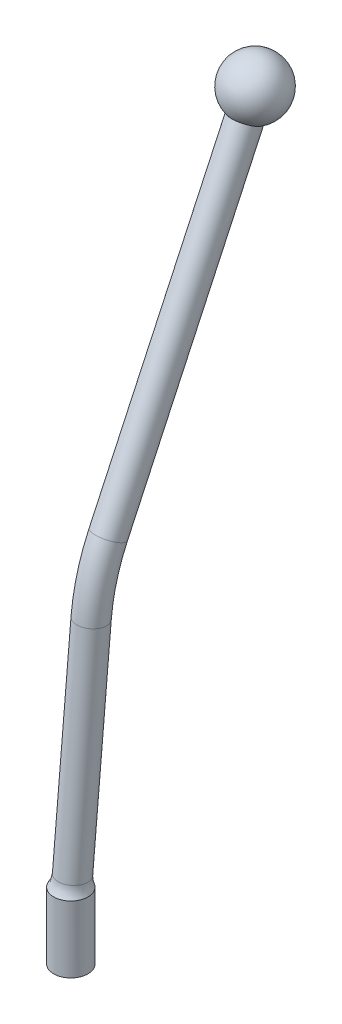
ISO-10303-21;
HEADER;
FILE_DESCRIPTION(('STEP AP214'),'2;1');
FILE_NAME('part.step','',(''),(''),'','','');
FILE_SCHEMA(('AUTOMOTIVE_DESIGN { 1 0 10303 214 1 1 1 1 }'));
ENDSEC;
DATA;
#1=APPLICATION_CONTEXT('core data for automotive mechanical design processes');
#2=APPLICATION_PROTOCOL_DEFINITION('international standard','automotive_design',2000,#1);
#3=PRODUCT_CONTEXT('',#1,'mechanical');
#4=PRODUCT('Part','Part','',(#3));
#5=PRODUCT_RELATED_PRODUCT_CATEGORY('part','',(#4));
#6=PRODUCT_DEFINITION_FORMATION('','',#4);
#7=PRODUCT_DEFINITION_CONTEXT('part definition',#1,'design');
#8=PRODUCT_DEFINITION('design','',#6,#7);
#9=PRODUCT_DEFINITION_SHAPE('','',#8);
#10=(LENGTH_UNIT() NAMED_UNIT(*) SI_UNIT(.MILLI.,.METRE.));
#11=(NAMED_UNIT(*) PLANE_ANGLE_UNIT() SI_UNIT($,.RADIAN.));
#12=(NAMED_UNIT(*) SI_UNIT($,.STERADIAN.) SOLID_ANGLE_UNIT());
#13=UNCERTAINTY_MEASURE_WITH_UNIT(LENGTH_MEASURE(1.E-05),#10,'distance_accuracy_value','');
#14=(GEOMETRIC_REPRESENTATION_CONTEXT(3) GLOBAL_UNCERTAINTY_ASSIGNED_CONTEXT((#13)) GLOBAL_UNIT_ASSIGNED_CONTEXT((#10,
#11,#12)) REPRESENTATION_CONTEXT('',''));
#15=CARTESIAN_POINT('',(0.,0.,0.));
#16=DIRECTION('',(0.,0.,1.));
#17=DIRECTION('',(1.,0.,0.));
#18=AXIS2_PLACEMENT_3D('',#15,#16,#17);
#19=CARTESIAN_POINT('',(0.,35.0728815140175,-9.6725456332811));
#20=DIRECTION('',(0.,-0.906307787036651,0.422618261740697));
#21=DIRECTION('',(0.,-0.422618261740697,-0.906307787036651));
#22=AXIS2_PLACEMENT_3D('',#19,#20,#21);
#23=CYLINDRICAL_SURFACE('',#22,0.75);
#24=CARTESIAN_POINT('',(0.,18.5447909300919,-1.96537041931714));
#25=DIRECTION('',(0.,0.906307787036651,-0.422618261740697));
#26=DIRECTION('',(0.,0.422618261740697,0.906307787036651));
#27=AXIS2_PLACEMENT_3D('',#24,#25,#26);
#28=CIRCLE('',#27,0.75);
#29=CARTESIAN_POINT('',(0.,18.8617546263974,-1.28563957903965));
#30=VERTEX_POINT('',#29);
#31=EDGE_CURVE('E133',#30,#30,#28,.T.);
#32=ORIENTED_EDGE('',*,*,#31,.T.);
#33=EDGE_LOOP('',(#32));
#34=FACE_BOUND('',#33,.T.);
#35=CARTESIAN_POINT('',(0.,33.8955531631854,-9.12354840712511));
#36=DIRECTION('',(0.,0.906307787036653,-0.422618261740697));
#37=DIRECTION('',(0.,0.422618261740696,0.906307787036651));
#38=AXIS2_PLACEMENT_3D('',#35,#36,#37);
#39=CIRCLE('',#38,0.75);
#40=CARTESIAN_POINT('',(0.,34.2125168594909,-8.44381756684762));
#41=VERTEX_POINT('',#40);
#42=EDGE_CURVE('E64',#41,#41,#39,.T.);
#43=ORIENTED_EDGE('',*,*,#42,.F.);
#44=EDGE_LOOP('',(#43));
#45=FACE_BOUND('',#44,.T.);
#46=ADVANCED_FACE('F52',(#34,#45),#23,.T.);
#47=CARTESIAN_POINT('',(0.,3.5,0.));
#48=DIRECTION('',(0.,-1.,0.));
#49=DIRECTION('',(0.,0.,-1.));
#50=AXIS2_PLACEMENT_3D('',#47,#48,#49);
#51=CYLINDRICAL_SURFACE('',#50,0.9);
#52=CARTESIAN_POINT('',(0.,3.5,0.));
#53=DIRECTION('',(0.,1.,0.));
#54=DIRECTION('',(0.,0.,1.));
#55=AXIS2_PLACEMENT_3D('',#52,#53,#54);
#56=CIRCLE('',#55,0.9);
#57=CARTESIAN_POINT('',(0.,3.5,0.9));
#58=VERTEX_POINT('',#57);
#59=EDGE_CURVE('E69',#58,#58,#56,.T.);
#60=ORIENTED_EDGE('',*,*,#59,.F.);
#61=EDGE_LOOP('',(#60));
#62=FACE_BOUND('',#61,.T.);
#63=CARTESIAN_POINT('',(0.,0.,0.));
#64=DIRECTION('',(0.,1.,0.));
#65=DIRECTION('',(0.,0.,1.));
#66=AXIS2_PLACEMENT_3D('',#63,#64,#65);
#67=CIRCLE('',#66,0.9);
#68=CARTESIAN_POINT('',(0.,0.,0.9));
#69=VERTEX_POINT('',#68);
#70=EDGE_CURVE('E140',#69,#69,#67,.T.);
#71=ORIENTED_EDGE('',*,*,#70,.T.);
#72=EDGE_LOOP('',(#71));
#73=FACE_BOUND('',#72,.T.);
#74=ADVANCED_FACE('F85',(#62,#73),#51,.T.);
#75=CARTESIAN_POINT('',(0.,0.,0.));
#76=DIRECTION('',(0.,1.,0.));
#77=DIRECTION('',(0.,0.,1.));
#78=AXIS2_PLACEMENT_3D('',#75,#76,#77);
#79=PLANE('',#78);
#80=ORIENTED_EDGE('',*,*,#70,.F.);
#81=EDGE_LOOP('',(#80));
#82=FACE_BOUND('',#81,.T.);
#83=ADVANCED_FACE('F99',(#82),#79,.F.);
#84=CARTESIAN_POINT('',(0.,14.3186083126849,-11.0284482896836));
#85=DIRECTION('',(1.,0.,0.));
#86=DIRECTION('',(0.,0.,-1.));
#87=AXIS2_PLACEMENT_3D('',#84,#85,#86);
#88=TOROIDAL_SURFACE('',#87,10.,0.75);
#89=CARTESIAN_POINT('',(0.,15.1901657401615,-1.06650130876619));
#90=DIRECTION('',(0.,0.996194698091746,-0.0871557427476545));
#91=DIRECTION('',(0.,0.0871557427476545,0.996194698091746));
#92=AXIS2_PLACEMENT_3D('',#89,#90,#91);
#93=CIRCLE('',#92,0.75);
#94=CARTESIAN_POINT('',(0.,15.2555325472222,-0.319355285197378));
#95=VERTEX_POINT('',#94);
#96=EDGE_CURVE('E135',#95,#95,#93,.T.);
#97=CARTESIAN_POINT('',(0.,14.3186083126849,-11.0284482896836));
#98=DIRECTION('',(1.,0.,0.));
#99=DIRECTION('',(0.,0.,-1.));
#100=AXIS2_PLACEMENT_3D('',#97,#98,#99);
#101=CIRCLE('',#100,10.75);
#102=EDGE_CURVE('',#30,#95,#101,.T.);
#103=ORIENTED_EDGE('',*,*,#31,.F.);
#104=ORIENTED_EDGE('',*,*,#96,.T.);
#105=ORIENTED_EDGE('',*,*,#102,.T.);
#106=ORIENTED_EDGE('',*,*,#102,.F.);
#107=EDGE_LOOP('',(#103,#105,#104,#106));
#108=FACE_BOUND('',#107,.T.);
#109=ADVANCED_FACE('F101',(#108),#88,.T.);
#110=CARTESIAN_POINT('',(0.,15.1901657401615,-1.06650130876619));
#111=DIRECTION('',(0.,-0.996194698091746,0.0871557427476545));
#112=DIRECTION('',(0.,-0.0871557427476545,-0.996194698091746));
#113=AXIS2_PLACEMENT_3D('',#110,#111,#112);
#114=CYLINDRICAL_SURFACE('',#113,0.75);
#115=CARTESIAN_POINT('',(0.144872665695192,3.5,0.888263424179094));
#116=CARTESIAN_POINT('',(0.115218978269698,3.74497205502854,0.678751725925156));
#117=CARTESIAN_POINT('',(0.11430068469154,4.06745761710978,0.650680038869779));
#118=CARTESIAN_POINT('',(0.0921290824477016,3.5,0.896865659666512));
#119=CARTESIAN_POINT('',(0.073220313796733,3.74494257312776,0.685308371742875));
#120=CARTESIAN_POINT('',(0.0726260908254238,4.06773638086897,0.65710651207005));
#121=CARTESIAN_POINT('',(0.0385680212555081,3.5,0.900762478531345));
#122=CARTESIAN_POINT('',(0.0306578230844865,3.74492808348338,0.688272401762609));
#123=CARTESIAN_POINT('',(0.030408063894255,4.067860466844,0.660010106207986));
#124=CARTESIAN_POINT('',(-0.0683853884735945,3.5,0.898990539138627));
#125=CARTESIAN_POINT('',(-0.0543580848616057,3.74493445468907,0.686923323638316));
#126=CARTESIAN_POINT('',(-0.0539162003488355,4.06780362065551,0.658688327513635));
#127=CARTESIAN_POINT('',(-0.121777737115939,3.5,0.893321786860164));
#128=CARTESIAN_POINT('',(-0.0968027482855262,3.74495531418536,0.682610498040408));
#129=CARTESIAN_POINT('',(-0.0960224377306163,4.06762268868264,0.654462959137402));
#130=CARTESIAN_POINT('',(-0.226594238547997,3.5,0.872644511394423));
#131=CARTESIAN_POINT('',(-0.180321745645892,3.74502457960037,0.666844380350451));
#132=CARTESIAN_POINT('',(-0.178924007320643,4.06694955779518,0.6390050445295));
#133=CARTESIAN_POINT('',(-0.278018564194649,3.5,0.857636810480751));
#134=CARTESIAN_POINT('',(-0.221388012795168,3.7450729698878,0.655394917555623));
#135=CARTESIAN_POINT('',(-0.219719454608506,4.06645738628446,0.627773115209686));
#136=CARTESIAN_POINT('',(-0.377210202240537,3.5,0.818870053100799));
#137=CARTESIAN_POINT('',(-0.300949170618562,3.74517715516498,0.625718638318771));
#138=CARTESIAN_POINT('',(-0.298845560735343,4.06514618564763,0.598624309389588));
#139=CARTESIAN_POINT('',(-0.424977512927383,3.5,0.795110992536743));
#140=CARTESIAN_POINT('',(-0.339437334214409,3.74523293678978,0.607497603116569));
#141=CARTESIAN_POINT('',(-0.337176218420183,4.06432715636847,0.580707429759115));
#142=CARTESIAN_POINT('',(-0.515347157362014,3.5,0.739747148962994));
#143=CARTESIAN_POINT('',(-0.412736386168035,3.74532170320238,0.564845272666399));
#144=CARTESIAN_POINT('',(-0.410288592219785,4.06234054080428,0.538699451876321));
#145=CARTESIAN_POINT('',(-0.557949016038035,3.5,0.70814164512152));
#146=CARTESIAN_POINT('',(-0.447542410416707,3.74535469167394,0.540421166055499));
#147=CARTESIAN_POINT('',(-0.445069981858308,4.06117292249332,0.514607786356328));
#148=CARTESIAN_POINT('',(-0.63671434007839,3.5,0.638253343562561));
#149=CARTESIAN_POINT('',(-0.512494035429286,3.74536104347518,0.486110176919402));
#150=CARTESIAN_POINT('',(-0.510093113617592,4.05846649975031,0.460939737127125));
#151=CARTESIAN_POINT('',(-0.672877797504361,3.5,0.599970537612271));
#152=CARTESIAN_POINT('',(-0.542637809029118,3.74533445331093,0.45623220705572));
#153=CARTESIAN_POINT('',(-0.540334850141086,4.0569276948606,0.431363346655501));
#154=CARTESIAN_POINT('',(-0.737786727135213,3.5,0.518074899352608));
#155=CARTESIAN_POINT('',(-0.597444820200526,3.74518260313474,0.391898776610569));
#156=CARTESIAN_POINT('',(-0.595425062859597,4.05346099468572,0.367565441220684));
#157=CARTESIAN_POINT('',(-0.766531050206951,3.5,0.474461242899412));
#158=CARTESIAN_POINT('',(-0.622108322110622,3.74505743278486,0.357451747616598));
#159=CARTESIAN_POINT('',(-0.620272703480544,4.05153303920819,0.333343207924397));
#160=CARTESIAN_POINT('',(-0.815909393715593,3.5,0.383374546420374));
#161=CARTESIAN_POINT('',(-0.665293516595222,3.74467204400579,0.28498364063078));
#162=CARTESIAN_POINT('',(-0.663863572528438,4.04728200444597,0.261233596156636));
#163=CARTESIAN_POINT('',(-0.83654341714807,3.5,0.335901507820018));
#164=CARTESIAN_POINT('',(-0.683819171497357,3.74441199609345,0.246970965162709));
#165=CARTESIAN_POINT('',(-0.682606803210073,4.04495892530722,0.223346219038906));
#166=CARTESIAN_POINT('',(-0.869312434339306,3.5,0.238603334602884));
#167=CARTESIAN_POINT('',(-0.714249979433765,3.74372818957265,0.168447590438317));
#168=CARTESIAN_POINT('',(-0.713457051593159,4.03992904605581,0.144985309736057));
#169=CARTESIAN_POINT('',(-0.881447225646521,3.5,0.188778143988063));
#170=CARTESIAN_POINT('',(-0.726161405500642,3.74330465523457,0.127943591501877));
#171=CARTESIAN_POINT('',(-0.725563911214886,4.03722223680456,0.104511715972365));
#172=CARTESIAN_POINT('',(-0.897104022234932,3.5,0.0882696112084913));
#173=CARTESIAN_POINT('',(-0.743062206486551,3.74227754991546,0.0455644204726872));
#174=CARTESIAN_POINT('',(-0.742796686908443,4.03145928347461,0.0221317837974606));
#175=CARTESIAN_POINT('',(-0.900626026106163,3.5,0.0375862689032577));
#176=CARTESIAN_POINT('',(-0.748059832953143,3.74167424050672,0.00369362750762329));
#177=CARTESIAN_POINT('',(-0.747922601837451,4.02840313933874,-0.0197745548483));
#178=CARTESIAN_POINT('',(-0.899191726937016,3.5,-0.0631998548997993));
#179=CARTESIAN_POINT('',(-0.75101019256316,3.74028748869354,-0.0802632401717003));
#180=CARTESIAN_POINT('',(-0.75104740746664,4.02200293525744,-0.103822459098832));
#181=CARTESIAN_POINT('',(-0.894236498942878,3.5,-0.11330270920142));
#182=CARTESIAN_POINT('',(-0.748973031272966,3.73950432582538,-0.122347790711306));
#183=CARTESIAN_POINT('',(-0.74904720183609,4.0186589118707,-0.145963994201492));
#184=CARTESIAN_POINT('',(-0.876198875085888,3.5,-0.211595099944645));
#185=CARTESIAN_POINT('',(-0.737911084278695,3.73777630288877,-0.205585176944655));
#186=CARTESIAN_POINT('',(-0.737978348023366,4.01177206285762,-0.229290614754966));
#187=CARTESIAN_POINT('',(-0.863116474743432,3.5,-0.259784635331634));
#188=CARTESIAN_POINT('',(-0.728895474758998,3.73683164840063,-0.246739625265592));
#189=CARTESIAN_POINT('',(-0.728909695945145,4.00822923712171,-0.270475699678583));
#190=CARTESIAN_POINT('',(-0.829358272482915,3.5,-0.353019762483498));
#191=CARTESIAN_POINT('',(-0.70411116849955,3.73481876024883,-0.326980659367606));
#192=CARTESIAN_POINT('',(-0.703962561198934,4.00106250587298,-0.350717787549539));
#193=CARTESIAN_POINT('',(-0.808683161585227,3.5,-0.398065639912068));
#194=CARTESIAN_POINT('',(-0.688351199678615,3.73375064889424,-0.366072024782644));
#195=CARTESIAN_POINT('',(-0.688084698222155,3.99743860776683,-0.389774983786855));
#196=CARTESIAN_POINT('',(-0.760426951398119,3.5,-0.483917043211074));
#197=CARTESIAN_POINT('',(-0.650489898848179,3.73154723009054,-0.44110154606573));
#198=CARTESIAN_POINT('',(-0.649970410534667,3.99025150157258,-0.464659342991497));
#199=CARTESIAN_POINT('',(-0.732846003007711,3.5,-0.524722661707572));
#200=CARTESIAN_POINT('',(-0.628394787399165,3.73041190993933,-0.47704688933656));
#201=CARTESIAN_POINT('',(-0.627734124759938,3.9866882921602,-0.50048657651327));
#202=CARTESIAN_POINT('',(-0.671595324575706,3.5,-0.601130151674646));
#203=CARTESIAN_POINT('',(-0.578449124217927,3.72814545814495,-0.544768637877386));
#204=CARTESIAN_POINT('',(-0.577532983018823,3.97978255319501,-0.567902232088768));
#205=CARTESIAN_POINT('',(-0.637925277413608,3.5,-0.636731751945046));
#206=CARTESIAN_POINT('',(-0.550601545578459,3.7270141802506,-0.576553697768652));
#207=CARTESIAN_POINT('',(-0.549567828682665,3.9764400351482,-0.599490433224189));
#208=CARTESIAN_POINT('',(-0.565426816941827,3.5,-0.701903275611725));
#209=CARTESIAN_POINT('',(-0.489906841035316,3.72483663658916,-0.635034395921961));
#210=CARTESIAN_POINT('',(-0.488701663513053,3.9701445621659,-0.657536815335355));
#211=CARTESIAN_POINT('',(-0.526598278026571,3.5,-0.73147305209296));
#212=CARTESIAN_POINT('',(-0.457059578565364,3.72379011651889,-0.661739511153283));
#213=CARTESIAN_POINT('',(-0.455800532489587,3.96719161671971,-0.683994871357154));
#214=CARTESIAN_POINT('',(-0.444797143281604,3.5,-0.783911696582177));
#215=CARTESIAN_POINT('',(-0.387268485714118,3.72186392710655,-0.70928086250745));
#216=CARTESIAN_POINT('',(-0.385984982011126,3.96183848458491,-0.731046001742872));
#217=CARTESIAN_POINT('',(-0.401822777574557,3.5,-0.806777685729815));
#218=CARTESIAN_POINT('',(-0.350319482030246,3.72098401323148,-0.730123770509194));
#219=CARTESIAN_POINT('',(-0.349068847663832,3.9594385354683,-0.751636556273219));
#220=CARTESIAN_POINT('',(-0.312866844339337,3.5,-0.845257043848739));
#221=CARTESIAN_POINT('',(-0.273400273390439,3.71946650544805,-0.765287752549723));
#222=CARTESIAN_POINT('',(-0.272295953700744,3.95533881902649,-0.786349135635514));
#223=CARTESIAN_POINT('',(-0.26688731576901,3.5,-0.860875273219228));
#224=CARTESIAN_POINT('',(-0.233425666932865,3.71882844455222,-0.779620789398089));
#225=CARTESIAN_POINT('',(-0.23244118559896,3.95363858255587,-0.800475495313711));
#226=CARTESIAN_POINT('',(-0.184052734108374,3.5,-0.881760351223781));
#227=CARTESIAN_POINT('',(-0.161173150673931,3.71796441485557,-0.79881155398799));
#228=CARTESIAN_POINT('',(-0.160451902881568,3.95134697047649,-0.819382799495625));
#229=CARTESIAN_POINT('',(-0.147570547625132,3.5,-0.888591843433462));
#230=CARTESIAN_POINT('',(-0.129272269834578,3.71767695396065,-0.805101559052182));
#231=CARTESIAN_POINT('',(-0.128684614779541,3.95058946542696,-0.82557492197002));
#232=CARTESIAN_POINT('',(-0.074060562601885,3.5,-0.897711504599987));
#233=CARTESIAN_POINT('',(-0.0649178871766531,3.71729187323739,-0.813500702033068));
#234=CARTESIAN_POINT('',(-0.0646129872745205,3.94957595257383,-0.833843199092542));
#235=CARTESIAN_POINT('',(-0.0370328486111949,3.5,-0.900000370292462));
#236=CARTESIAN_POINT('',(-0.032460033279359,3.71719417046728,-0.815611660858863));
#237=CARTESIAN_POINT('',(-0.0323087309967822,3.94931986786382,-0.83591998493967));
#238=CARTESIAN_POINT('',(0.0415279753308291,3.5,-0.899999584760643));
#239=CARTESIAN_POINT('',(0.0364001024294071,3.71719425842092,-0.815610770703013));
#240=CARTESIAN_POINT('',(0.0362304341712164,3.94932004259117,-0.835919193498325));
#241=CARTESIAN_POINT('',(0.0830624074363659,3.5,-0.897120460026502));
#242=CARTESIAN_POINT('',(0.0728090996094106,3.71731721921744,-0.812955221701885));
#243=CARTESIAN_POINT('',(0.0724664952923333,3.94964226451807,-0.833306752102238));
#244=CARTESIAN_POINT('',(0.16531893009291,3.5,-0.885660151915032));
#245=CARTESIAN_POINT('',(0.14479776250101,3.71780024927461,-0.802402586509528));
#246=CARTESIAN_POINT('',(0.144143891097036,3.95091444964467,-0.822917695788122));
#247=CARTESIAN_POINT('',(0.206041623528748,3.5,-0.877083376140412));
#248=CARTESIAN_POINT('',(0.180384246913796,3.71816021985207,-0.794507692822064));
#249=CARTESIAN_POINT('',(0.179585818217885,3.95186392760698,-0.815145072698895));
#250=CARTESIAN_POINT('',(0.292537220791462,3.5,-0.85250183514118));
#251=CARTESIAN_POINT('',(0.255733092614914,3.7191699281527,-0.771939144188175));
#252=CARTESIAN_POINT('',(0.254680939147091,3.95454922870689,-0.792902954297423));
#253=CARTESIAN_POINT('',(0.338041992629403,3.5,-0.835508956195263));
#254=CARTESIAN_POINT('',(0.295227501240893,3.71985772219643,-0.756361075034669));
#255=CARTESIAN_POINT('',(0.294070562786826,3.95638853749379,-0.77754368121024));
#256=CARTESIAN_POINT('',(0.425825633942387,3.5,-0.794370257147718));
#257=CARTESIAN_POINT('',(0.370972873675412,3.72146171556064,-0.718815229145857));
#258=CARTESIAN_POINT('',(0.369701006114158,3.96074128388088,-0.740463782365862));
#259=CARTESIAN_POINT('',(0.468103490230098,3.5,-0.770222201987042));
#260=CARTESIAN_POINT('',(0.40722875533163,3.72237829882419,-0.696837482620303));
#261=CARTESIAN_POINT('',(0.405940837320997,3.96325493210093,-0.718741168919152));
#262=CARTESIAN_POINT('',(0.548332746880054,3.5,-0.715327317859359));
#263=CARTESIAN_POINT('',(0.475470138976775,3.72436319949348,-0.647155577702713));
#264=CARTESIAN_POINT('',(0.474237005570385,3.96880679649227,-0.669545873386416));
#265=CARTESIAN_POINT('',(0.586284252742513,3.5,-0.684580649855547));
#266=CARTESIAN_POINT('',(0.507458536700289,3.72543182283447,-0.619442212300281));
#267=CARTESIAN_POINT('',(0.5062934446298,3.97184499986749,-0.642073331561614));
#268=CARTESIAN_POINT('',(0.656845921387437,3.5,-0.617197891280655));
#269=CARTESIAN_POINT('',(0.566282039471467,3.72763822648057,-0.559106683563361));
#270=CARTESIAN_POINT('',(0.56530972768512,3.97827954807054,-0.582152859523094));
#271=CARTESIAN_POINT('',(0.689456448078416,3.5,-0.580562202296317));
#272=CARTESIAN_POINT('',(0.5931168822476,3.7287762412027,-0.526475301512759));
#273=CARTESIAN_POINT('',(0.59226991893404,3.98167586847206,-0.5497052685771));
#274=CARTESIAN_POINT('',(0.748429505479414,3.5,-0.502250793816522));
#275=CARTESIAN_POINT('',(0.640918012940324,3.73104217071961,-0.457238675768827));
#276=CARTESIAN_POINT('',(0.640332984007674,3.98865889465661,-0.480746019470716));
#277=CARTESIAN_POINT('',(0.774791719428875,3.5,-0.460574818963566));
#278=CARTESIAN_POINT('',(0.661880159114435,3.73217020764026,-0.42062461338541));
#279=CARTESIAN_POINT('',(0.661435560887709,3.99224561008051,-0.444234155408315));
#280=CARTESIAN_POINT('',(0.820469816015249,3.5,-0.373176123182512));
#281=CARTESIAN_POINT('',(0.697384409494985,3.73434732935684,-0.344453809421102));
#282=CARTESIAN_POINT('',(0.69718237308844,3.999451730974,-0.368178860586403));
#283=CARTESIAN_POINT('',(0.839785618531148,3.5,-0.32745335624783));
#284=CARTESIAN_POINT('',(0.711919913073536,3.73539640286408,-0.304890330572249));
#285=CARTESIAN_POINT('',(0.711826534974315,4.00307113681482,-0.328635395362347));
#286=CARTESIAN_POINT('',(0.870708260436181,3.5,-0.233091637571739));
#287=CARTESIAN_POINT('',(0.734194579828599,3.7373624970689,-0.223919412466348));
#288=CARTESIAN_POINT('',(0.734239050493792,4.01020432265257,-0.247641537534588));
#289=CARTESIAN_POINT('',(0.882315960844095,3.5,-0.184453012202689));
#290=CARTESIAN_POINT('',(0.741926116157801,3.73827940125211,-0.182508106357371));
#291=CARTESIAN_POINT('',(0.742008172122854,4.01371811440504,-0.206191358469974));
#292=CARTESIAN_POINT('',(0.897325463342485,3.5,-0.0855032830008968));
#293=CARTESIAN_POINT('',(0.750397087431718,3.73994705838918,-0.0989690827473031));
#294=CARTESIAN_POINT('',(0.75045288259098,4.02052814354794,-0.122555734398384));
#295=CARTESIAN_POINT('',(0.900727278250593,3.5,-0.0351921817806943));
#296=CARTESIAN_POINT('',(0.751127270400769,3.74069759299596,-0.0568403306644344));
#297=CARTESIAN_POINT('',(0.751128482510164,4.02382438127817,-0.0803702905399986));
#298=CARTESIAN_POINT('',(0.8990134559276,3.5,0.0657419735649628));
#299=CARTESIAN_POINT('',(0.745573118820168,3.74201767508037,0.0269844193996063));
#300=CARTESIAN_POINT('',(0.745367379848269,4.03011503951028,0.00353545627798873));
#301=CARTESIAN_POINT('',(0.893898228887629,3.5,0.116365012550129));
#302=CARTESIAN_POINT('',(0.739280018808063,3.74258697055352,0.068678390416319));
#303=CARTESIAN_POINT('',(0.738931019792879,4.03310947453997,0.0452557815408517));
#304=CARTESIAN_POINT('',(0.875060248015282,3.5,0.216480157150468));
#305=CARTESIAN_POINT('',(0.719833156098863,3.74354802920134,0.15049435712717));
#306=CARTESIAN_POINT('',(0.719129562058335,4.03874088435196,0.127046808742519));
#307=CARTESIAN_POINT('',(0.861337490656201,3.5,0.265972262302261));
#308=CARTESIAN_POINT('',(0.706671421693391,3.7439395345319,0.190611488402456));
#309=CARTESIAN_POINT('',(0.705764461540314,4.0413778589878,0.167117510005427));
#310=CARTESIAN_POINT('',(0.825444582995845,3.5,0.362331991978562));
#311=CARTESIAN_POINT('',(0.673815323525891,3.74456388293561,0.268164202495326));
#312=CARTESIAN_POINT('',(0.672483326549712,4.0462648533399,0.24447250934632));
#313=CARTESIAN_POINT('',(0.803273549439183,3.5,0.409199341500731));
#314=CARTESIAN_POINT('',(0.654114266717505,3.74479649062001,0.305592376285726));
#315=CARTESIAN_POINT('',(0.652566607144375,4.04851483256061,0.281756515591579));
#316=CARTESIAN_POINT('',(0.750926846727437,3.5,0.498799077305495));
#317=CARTESIAN_POINT('',(0.608686540381498,3.74513329456589,0.376700903333722));
#318=CARTESIAN_POINT('',(0.60674792629236,4.05261973477513,0.352470784267096));
#319=CARTESIAN_POINT('',(0.720751168992739,3.5,0.541531459156042));
#320=CARTESIAN_POINT('',(0.582956412815826,3.74523733229068,0.410372645326327));
#321=CARTESIAN_POINT('',(0.580845958430521,4.05447465734551,0.385901042566737));
#322=CARTESIAN_POINT('',(0.653131458539328,3.5,0.621415885182218));
#323=CARTESIAN_POINT('',(0.526148389778643,3.74535410090908,0.47299141339042));
#324=CARTESIAN_POINT('',(0.523788160500315,4.05779843508201,0.447957782692574));
#325=CARTESIAN_POINT('',(0.615686527706953,3.5,0.658567238816686));
#326=CARTESIAN_POINT('',(0.495069272657004,3.74536672727021,0.501928674067416));
#327=CARTESIAN_POINT('',(0.492631681301423,4.05926724249089,0.476583670124777));
#328=CARTESIAN_POINT('',(0.534570265336709,3.5,0.725957701390986));
#329=CARTESIAN_POINT('',(0.428414456850086,3.74533953560639,0.55420580757837));
#330=CARTESIAN_POINT('',(0.425951220716143,4.06183754373629,0.528208744658734));
#331=CARTESIAN_POINT('',(0.490898935036864,3.5,0.756196811705209));
#332=CARTESIAN_POINT('',(0.39284110877491,3.7452996800819,0.577536903493975));
#333=CARTESIAN_POINT('',(0.390427240198168,4.06293903764584,0.551207932879269));
#334=CARTESIAN_POINT('',(0.398649176801071,3.5,0.808636775851475));
#335=CARTESIAN_POINT('',(0.318199613755932,3.74520337755649,0.617881824072806));
#336=CARTESIAN_POINT('',(0.316021022095535,4.06479759580854,0.590921184581236));
#337=CARTESIAN_POINT('',(0.350070888661562,3.5,0.830837858599789));
#338=CARTESIAN_POINT('',(0.279136550017404,3.74514693044863,0.634888374194692));
#339=CARTESIAN_POINT('',(0.277138880187558,4.06555466987064,0.607635427053166));
#340=CARTESIAN_POINT('',(0.249558530932094,3.5,0.866349390691876));
#341=CARTESIAN_POINT('',(0.198641395994059,3.74504600237387,0.66204777178453));
#342=CARTESIAN_POINT('',(0.197119253068243,4.06674527677205,0.634301113767742));
#343=CARTESIAN_POINT('',(0.197624464631678,3.5,0.879659848750643));
#344=CARTESIAN_POINT('',(0.157216371766591,3.74500153603713,0.672195278526602));
#345=CARTESIAN_POINT('',(0.155981770067735,4.0671788099285,0.644252564639584));
#346=CARTESIAN_POINT('',(0.144872665695192,3.5,0.888263424179094));
#347=CARTESIAN_POINT('',(0.115218978269698,3.74497205502854,0.678751725925156));
#348=CARTESIAN_POINT('',(0.11430068469154,4.06745761710978,0.650680038869779));
#349=(BOUNDED_SURFACE() B_SPLINE_SURFACE(3,2,((#115,#116,#117),(#118,#119,#120),(#121,#122,
#123),(#124,#125,#126),(#127,#128,#129),(#130,#131,#132),(#133,#134,#135),(#136,#137,#138),
(#139,#140,#141),(#142,#143,#144),(#145,#146,#147),(#148,#149,#150),(#151,#152,#153),(#154,#155,
#156),(#157,#158,#159),(#160,#161,#162),(#163,#164,#165),(#166,#167,#168),(#169,#170,#171),
(#172,#173,#174),(#175,#176,#177),(#178,#179,#180),(#181,#182,#183),(#184,#185,#186),(#187,#188,
#189),(#190,#191,#192),(#193,#194,#195),(#196,#197,#198),(#199,#200,#201),(#202,#203,#204),
(#205,#206,#207),(#208,#209,#210),(#211,#212,#213),(#214,#215,#216),(#217,#218,#219),(#220,#221,
#222),(#223,#224,#225),(#226,#227,#228),(#229,#230,#231),(#232,#233,#234),(#235,#236,#237),
(#238,#239,#240),(#241,#242,#243),(#244,#245,#246),(#247,#248,#249),(#250,#251,#252),(#253,#254,
#255),(#256,#257,#258),(#259,#260,#261),(#262,#263,#264),(#265,#266,#267),(#268,#269,#270),
(#271,#272,#273),(#274,#275,#276),(#277,#278,#279),(#280,#281,#282),(#283,#284,#285),(#286,#287,
#288),(#289,#290,#291),(#292,#293,#294),(#295,#296,#297),(#298,#299,#300),(#301,#302,#303),
(#304,#305,#306),(#307,#308,#309),(#310,#311,#312),(#313,#314,#315),(#316,#317,#318),(#319,#320,
#321),(#322,#323,#324),(#325,#326,#327),(#328,#329,#330),(#331,#332,#333),(#334,#335,#336),
(#337,#338,#339),(#340,#341,#342),(#343,#344,#345),(#346,#347,#348)),.UNSPECIFIED.,.T.,.F.,
.F.) B_SPLINE_SURFACE_WITH_KNOTS((4,2,2,2,2,2,2,2,2,2,2,2,2,2,2,2,2,2,2,2,2,2,2,2,2,2,2,2,2,2,2,
2,2,2,2,2,2,2,4),(3,3),(0.,0.294822732336872,0.589645280390885,0.884441873649071,
1.17923860494426,1.47406242845555,1.76888661547351,2.06375643978516,2.3586261551853,
2.65350289413751,2.94837968136279,3.24321907634871,3.53805863384684,3.83287136434185,
4.12767765346489,4.42249930053468,4.71732812761616,5.01228338053415,5.30704054750325,
5.53305497173423,5.7590347278111,6.01244439213329,6.26565825111665,6.56043235509828,
6.85529863477441,7.15015772245035,7.44499671148735,7.73985064430201,8.03470792964014,
8.32953227296718,8.62435615577689,8.91916583991945,9.21397564485247,9.50881628019608,
9.80365723155984,10.0985346336293,10.3934119770669,10.6882809219848,10.9831495778583),(0.,1.),
.UNSPECIFIED.) GEOMETRIC_REPRESENTATION_ITEM() RATIONAL_B_SPLINE_SURFACE(((1.,0.951395204658356,
1.),(1.,0.951306723598028,1.),(1.,0.951266822421772,1.),(1.,0.951285000944842,1.),(1.,
0.951343080582925,1.),(1.,0.951556014915094,1.),(1.,0.951710861089107,1.),(1.,0.952114096013521,
1.),(1.,0.952362484807723,1.),(1.,0.952947544123043,1.),(1.,0.953284222755272,1.),(1.,
0.954038465451206,1.),(1.,0.954456029614639,1.),(1.,0.955362612097737,1.),(1.,0.95585164146814,
1.),(1.,0.956889508731597,1.),(1.,0.957438346602561,1.),(1.,0.958582241303955,1.),(1.,
0.959177299234971,1.),(1.,0.960398183101379,1.),(1.,0.961024009041807,1.),(1.,0.9622893404531,
1.),(1.,0.962928844179251,1.),(1.,0.964203421066407,1.),(1.,0.96483849422497,1.),(1.,
0.966085270961216,1.),(1.,0.966696976660004,1.),(1.,0.967878100809507,1.),(1.,0.968447520183865,
1.),(1.,0.969525752555157,1.),(1.,0.970034562393254,1.),(1.,0.970974550478256,1.),(1.,
0.971405726834239,1.),(1.,0.972175725640823,1.),(1.,0.97251450840977,1.),(1.,0.973087306441107,
1.),(1.,0.973321391910425,1.),(1.,0.973635185091139,1.),(1.,0.973738164427123,1.),(1.,
0.973875732893424,1.),(1.,0.973910332511632,1.),(1.,0.973910317016613,1.),(1.,0.973866790692767,
1.),(1.,0.973693975315391,1.),(1.,0.973564752555251,1.),(1.,0.973195933811397,1.),(1.,
0.972941703289843,1.),(1.,0.972330667240324,1.),(1.,0.971973829662071,1.),(1.,0.971170181635401,
1.),(1.,0.970723373381699,1.),(1.,0.969755141334607,1.),(1.,0.969233722629352,1.),(1.,
0.968133535282931,1.),(1.,0.967554763736349,1.),(1.,0.966358424785018,1.),(1.,0.96574085693923,
1.),(1.,0.964486009710081,1.),(1.,0.963848732536638,1.),(1.,0.962573193979235,1.),(1.,
0.961934932596814,1.),(1.,0.960675453513579,1.),(1.,0.960054234993424,1.),(1.,0.958845540123629,
1.),(1.,0.958258063787815,1.),(1.,0.957131900770666,1.),(1.,0.956593219198046,1.),(1.,
0.955577953040599,1.),(1.,0.95510136852233,1.),(1.,0.954221453519328,1.),(1.,0.953818132098154,
1.),(1.,0.953093931723352,1.),(1.,0.95277305275333,1.),(1.,0.952220743931468,1.),(1.,
0.951989311532253,1.),(1.,0.951620789363297,1.),(1.,0.951483699501078,1.),(1.,0.951395204658356,1.))) REPRESENTATION_ITEM('') SURFACE());
#350=CARTESIAN_POINT('',(0.11430068469154,4.06745761710978,0.650680038869779));
#351=CARTESIAN_POINT('',(0.155981770067735,4.0671788099285,0.644252564639584));
#352=CARTESIAN_POINT('',(0.197119253068243,4.06674527677205,0.634301113767742));
#353=CARTESIAN_POINT('',(0.277138880187558,4.06555466987064,0.607635427053166));
#354=CARTESIAN_POINT('',(0.316021022095535,4.06479759580854,0.590921184581236));
#355=CARTESIAN_POINT('',(0.390427240198168,4.06293903764584,0.551207932879269));
#356=CARTESIAN_POINT('',(0.425951220716143,4.06183754373629,0.528208744658733));
#357=CARTESIAN_POINT('',(0.492631681301423,4.05926724249089,0.476583670124777));
#358=CARTESIAN_POINT('',(0.523788160500315,4.05779843508201,0.447957782692574));
#359=CARTESIAN_POINT('',(0.580845958430521,4.05447465734551,0.385901042566737));
#360=CARTESIAN_POINT('',(0.60674792629236,4.05261973477513,0.352470784267095));
#361=CARTESIAN_POINT('',(0.652566607144375,4.04851483256061,0.281756515591579));
#362=CARTESIAN_POINT('',(0.672483326549712,4.0462648533399,0.24447250934632));
#363=CARTESIAN_POINT('',(0.705764461540314,4.0413778589878,0.167117510005428));
#364=CARTESIAN_POINT('',(0.719129562058335,4.03874088435196,0.127046808742519));
#365=CARTESIAN_POINT('',(0.738931019792879,4.03310947453997,0.0452557815408516));
#366=CARTESIAN_POINT('',(0.745367379848269,4.03011503951028,0.00353545627798877));
#367=CARTESIAN_POINT('',(0.751128482510164,4.02382438127817,-0.0803702905399985));
#368=CARTESIAN_POINT('',(0.75045288259098,4.02052814354794,-0.122555734398385));
#369=CARTESIAN_POINT('',(0.742008172122854,4.01371811440504,-0.206191358469975));
#370=CARTESIAN_POINT('',(0.734239050493792,4.01020432265257,-0.247641537534588));
#371=CARTESIAN_POINT('',(0.711826534974315,4.00307113681482,-0.328635395362347));
#372=CARTESIAN_POINT('',(0.69718237308844,3.999451730974,-0.368178860586403));
#373=CARTESIAN_POINT('',(0.661435560887709,3.99224561008051,-0.444234155408315));
#374=CARTESIAN_POINT('',(0.640332984007674,3.98865889465661,-0.480746019470716));
#375=CARTESIAN_POINT('',(0.59226991893404,3.98167586847206,-0.5497052685771));
#376=CARTESIAN_POINT('',(0.56530972768512,3.97827954807054,-0.582152859523094));
#377=CARTESIAN_POINT('',(0.5062934446298,3.97184499986749,-0.642073331561614));
#378=CARTESIAN_POINT('',(0.474237005570385,3.96880679649227,-0.669545873386416));
#379=CARTESIAN_POINT('',(0.405940837320997,3.96325493210093,-0.718741168919152));
#380=CARTESIAN_POINT('',(0.369701006114158,3.96074128388088,-0.740463782365862));
#381=CARTESIAN_POINT('',(0.294070562786826,3.95638853749379,-0.77754368121024));
#382=CARTESIAN_POINT('',(0.254680939147091,3.95454922870689,-0.792902954297423));
#383=CARTESIAN_POINT('',(0.179585818217885,3.95186392760698,-0.815145072698895));
#384=CARTESIAN_POINT('',(0.144143891097036,3.95091444964467,-0.822917695788122));
#385=CARTESIAN_POINT('',(0.0724664952923333,3.94964226451807,-0.833306752102238));
#386=CARTESIAN_POINT('',(0.0362304341712164,3.94932004259117,-0.835919193498325));
#387=CARTESIAN_POINT('',(-0.0323087309967821,3.94931986786382,-0.83591998493967));
#388=CARTESIAN_POINT('',(-0.0646129872745205,3.94957595257383,-0.833843199092542));
#389=CARTESIAN_POINT('',(-0.128684614779541,3.95058946542696,-0.82557492197002));
#390=CARTESIAN_POINT('',(-0.160451902881568,3.95134697047649,-0.819382799495625));
#391=CARTESIAN_POINT('',(-0.23244118559896,3.95363858255587,-0.800475495313711));
#392=CARTESIAN_POINT('',(-0.272295953700744,3.95533881902649,-0.786349135635514));
#393=CARTESIAN_POINT('',(-0.349068847663832,3.9594385354683,-0.751636556273219));
#394=CARTESIAN_POINT('',(-0.385984982011126,3.96183848458491,-0.731046001742872));
#395=CARTESIAN_POINT('',(-0.455800532489587,3.96719161671971,-0.683994871357154));
#396=CARTESIAN_POINT('',(-0.488701663513053,3.9701445621659,-0.657536815335355));
#397=CARTESIAN_POINT('',(-0.549567828682665,3.9764400351482,-0.599490433224189));
#398=CARTESIAN_POINT('',(-0.577532983018823,3.97978255319501,-0.567902232088768));
#399=CARTESIAN_POINT('',(-0.627734124759938,3.9866882921602,-0.50048657651327));
#400=CARTESIAN_POINT('',(-0.649970410534667,3.99025150157258,-0.464659342991497));
#401=CARTESIAN_POINT('',(-0.688084698222155,3.99743860776683,-0.389774983786855));
#402=CARTESIAN_POINT('',(-0.703962561198934,4.00106250587298,-0.350717787549539));
#403=CARTESIAN_POINT('',(-0.728909695945145,4.00822923712171,-0.270475699678583));
#404=CARTESIAN_POINT('',(-0.737978348023366,4.01177206285762,-0.229290614754966));
#405=CARTESIAN_POINT('',(-0.74904720183609,4.0186589118707,-0.145963994201492));
#406=CARTESIAN_POINT('',(-0.75104740746664,4.02200293525744,-0.103822459098832));
#407=CARTESIAN_POINT('',(-0.747922601837451,4.02840313933874,-0.0197745548483001));
#408=CARTESIAN_POINT('',(-0.742796686908443,4.03145928347461,0.0221317837974604));
#409=CARTESIAN_POINT('',(-0.725563911214886,4.03722223680456,0.104511715972365));
#410=CARTESIAN_POINT('',(-0.713457051593159,4.03992904605581,0.144985309736057));
#411=CARTESIAN_POINT('',(-0.682606803210073,4.04495892530722,0.223346219038906));
#412=CARTESIAN_POINT('',(-0.663863572528438,4.04728200444597,0.261233596156636));
#413=CARTESIAN_POINT('',(-0.620272703480545,4.05153303920819,0.333343207924396));
#414=CARTESIAN_POINT('',(-0.595425062859597,4.05346099468572,0.367565441220684));
#415=CARTESIAN_POINT('',(-0.540334850141086,4.0569276948606,0.431363346655501));
#416=CARTESIAN_POINT('',(-0.510093113617592,4.05846649975031,0.460939737127125));
#417=CARTESIAN_POINT('',(-0.445069981858308,4.06117292249332,0.514607786356328));
#418=CARTESIAN_POINT('',(-0.410288592219785,4.06234054080428,0.538699451876321));
#419=CARTESIAN_POINT('',(-0.337176218420183,4.06432715636847,0.580707429759115));
#420=CARTESIAN_POINT('',(-0.298845560735343,4.06514618564763,0.598624309389588));
#421=CARTESIAN_POINT('',(-0.219719454608506,4.06645738628446,0.627773115209686));
#422=CARTESIAN_POINT('',(-0.178924007320643,4.06694955779518,0.6390050445295));
#423=CARTESIAN_POINT('',(-0.0960224377306162,4.06762268868264,0.654462959137402));
#424=CARTESIAN_POINT('',(-0.0539162003488354,4.06780362065551,0.658688327513635));
#425=CARTESIAN_POINT('',(0.030408063894255,4.067860466844,0.660010106207986));
#426=CARTESIAN_POINT('',(0.0726260908254238,4.06773638086897,0.65710651207005));
#427=CARTESIAN_POINT('',(0.11430068469154,4.06745761710978,0.650680038869779));
#428=B_SPLINE_CURVE_WITH_KNOTS('',3,(#350,#351,#352,#353,#354,#355,#356,#357,#358,#359,#360,
#361,#362,#363,#364,#365,#366,#367,#368,#369,#370,#371,#372,#373,#374,#375,#376,#377,#378,#379,
#380,#381,#382,#383,#384,#385,#386,#387,#388,#389,#390,#391,#392,#393,#394,#395,#396,#397,#398,
#399,#400,#401,#402,#403,#404,#405,#406,#407,#408,#409,#410,#411,#412,#413,#414,#415,#416,#417,
#418,#419,#420,#421,#422,#423,#424,#425,#426,#427),.UNSPECIFIED.,.T.,.F.,(4,2,2,2,2,2,2,2,2,2,2,
2,2,2,2,2,2,2,2,2,2,2,2,2,2,2,2,2,2,2,2,2,2,2,2,2,2,2,4),(0.,0.29486865587351,0.589737600791406,
0.88461494422901,1.17949234629842,1.47433329766218,1.76917393300579,2.06398373793881,
2.35879342208137,2.65361730489108,2.94844164821812,3.24329893355625,3.53815286637091,
3.83299185540791,4.12785094308385,4.42271722275998,4.71749132674161,4.97070518572497,
5.22411485004716,5.45009460612403,5.67610903035501,5.97086619732411,6.2658214502421,
6.56065027732358,6.85547192439338,7.15027821351641,7.44509094401142,7.73993050150955,
8.03476989649547,8.32964668372076,8.62452342267296,8.9193931380731,9.21426296238475,
9.50908714940271,9.803910972914,10.0987077042092,10.3935042974674,10.6883268455214,
10.9831495778583),.UNSPECIFIED.);
#429=CARTESIAN_POINT('',(0.11430068469154,4.06745761710978,0.650680038869779));
#430=VERTEX_POINT('',#429);
#431=EDGE_CURVE('E11',#430,#430,#428,.T.);
#432=ORIENTED_EDGE('',*,*,#431,.T.);
#433=EDGE_LOOP('',(#432));
#434=FACE_BOUND('',#433,.T.);
#435=ORIENTED_EDGE('',*,*,#96,.F.);
#436=EDGE_LOOP('',(#435));
#437=FACE_BOUND('',#436,.T.);
#438=ADVANCED_FACE('F78',(#434,#437),#114,.T.);
#439=CARTESIAN_POINT('',(0.,35.0728815140175,-9.67254563328111));
#440=DIRECTION('',(1.,0.,0.));
#441=DIRECTION('',(0.,0.422618261740697,0.906307787036651));
#442=AXIS2_PLACEMENT_3D('',#439,#440,#441);
#443=SPHERICAL_SURFACE('',#442,1.5);
#444=CARTESIAN_POINT('',(0.,35.0728815140175,-9.67254563328111));
#445=DIRECTION('',(0.,0.906307787036651,-0.422618261740696));
#446=DIRECTION('',(0.,0.422618261740696,0.906307787036651));
#447=AXIS2_PLACEMENT_3D('',#444,#445,#446);
#448=SPHERICAL_SURFACE('',#447,1.5);
#449=ORIENTED_EDGE('',*,*,#42,.T.);
#450=EDGE_LOOP('',(#449));
#451=FACE_BOUND('',#450,.T.);
#452=ADVANCED_FACE('F92',(#451),#448,.T.);
#453=ORIENTED_EDGE('',*,*,#431,.F.);
#454=EDGE_LOOP('',(#453));
#455=FACE_BOUND('',#454,.T.);
#456=ORIENTED_EDGE('',*,*,#59,.T.);
#457=EDGE_LOOP('',(#456));
#458=FACE_BOUND('',#457,.T.);
#459=ADVANCED_FACE('F88',(#455,#458),#349,.F.);
#460=CLOSED_SHELL('',(#46,#74,#83,#109,#438,#452,#459));
#461=CARTESIAN_POINT('',(0.,35.0728815140175,-9.67254563328111));
#462=DIRECTION('',(1.,0.,0.));
#463=DIRECTION('',(0.,0.422618261740697,0.906307787036651));
#464=AXIS2_PLACEMENT_3D('',#461,#462,#463);
#465=SPHERICAL_SURFACE('',#464,0.75);
#466=CARTESIAN_POINT('',(0.,35.0728815140175,-9.67254563328111));
#467=DIRECTION('',(0.,-0.906307787036651,0.422618261740697));
#468=DIRECTION('',(0.,-0.422618261740697,-0.906307787036651));
#469=AXIS2_PLACEMENT_3D('',#466,#467,#468);
#470=SPHERICAL_SURFACE('',#469,0.75);
#471=CARTESIAN_POINT('',(0.,35.0728815140175,-9.67254563328111));
#472=DIRECTION('',(0.,-0.906307787036651,0.422618261740697));
#473=DIRECTION('',(0.,-0.422618261740697,-0.906307787036651));
#474=AXIS2_PLACEMENT_3D('',#471,#472,#473);
#475=CIRCLE('',#474,0.75);
#476=CARTESIAN_POINT('',(0.,34.755917817712,-10.3522764735586));
#477=VERTEX_POINT('',#476);
#478=EDGE_CURVE('E132',#477,#477,#475,.T.);
#479=ORIENTED_EDGE('',*,*,#478,.T.);
#480=EDGE_LOOP('',(#479));
#481=FACE_BOUND('',#480,.T.);
#482=ADVANCED_FACE('F122',(#481),#470,.F.);
#483=CARTESIAN_POINT('',(0.,35.0728815140175,-9.6725456332811));
#484=DIRECTION('',(0.,0.906307787036651,-0.422618261740697));
#485=DIRECTION('',(0.,0.422618261740697,0.906307787036651));
#486=AXIS2_PLACEMENT_3D('',#483,#484,#485);
#487=PLANE('',#486);
#488=ORIENTED_EDGE('',*,*,#478,.F.);
#489=EDGE_LOOP('',(#488));
#490=FACE_BOUND('',#489,.T.);
#491=ADVANCED_FACE('F98',(#490),#487,.T.);
#492=CLOSED_SHELL('',(#482,#491));
#493=ORIENTED_CLOSED_SHELL('',*,#492,.T.);
#494=BREP_WITH_VOIDS('B2',#460,(#493));
#495=ADVANCED_BREP_SHAPE_REPRESENTATION('',(#18,#494),#14);
#496=SHAPE_DEFINITION_REPRESENTATION(#9,#495);
ENDSEC;
END-ISO-10303-21;
